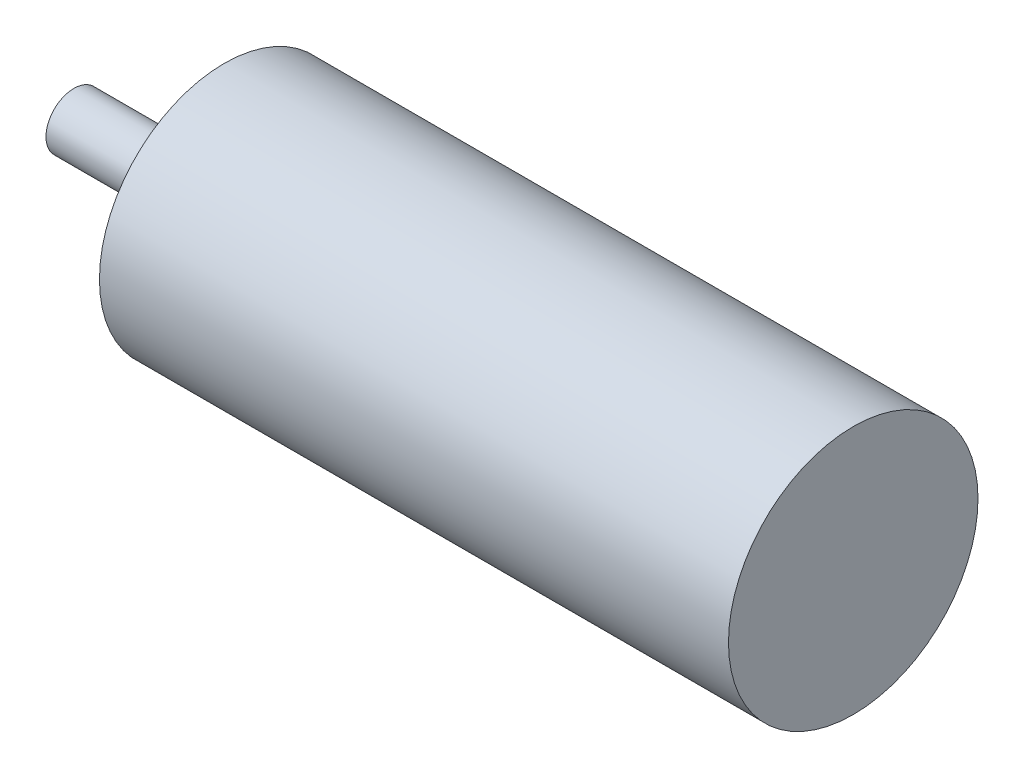
ISO-10303-21;
HEADER;
FILE_DESCRIPTION(('STEP AP214'),'2;1');
FILE_NAME('part.step','',(''),(''),'','','');
FILE_SCHEMA(('AUTOMOTIVE_DESIGN { 1 0 10303 214 1 1 1 1 }'));
ENDSEC;
DATA;
#1=APPLICATION_CONTEXT('core data for automotive mechanical design processes');
#2=APPLICATION_PROTOCOL_DEFINITION('international standard','automotive_design',2000,#1);
#3=PRODUCT_CONTEXT('',#1,'mechanical');
#4=PRODUCT('Part','Part','',(#3));
#5=PRODUCT_RELATED_PRODUCT_CATEGORY('part','',(#4));
#6=PRODUCT_DEFINITION_FORMATION('','',#4);
#7=PRODUCT_DEFINITION_CONTEXT('part definition',#1,'design');
#8=PRODUCT_DEFINITION('design','',#6,#7);
#9=PRODUCT_DEFINITION_SHAPE('','',#8);
#10=(LENGTH_UNIT() NAMED_UNIT(*) SI_UNIT(.MILLI.,.METRE.));
#11=(NAMED_UNIT(*) PLANE_ANGLE_UNIT() SI_UNIT($,.RADIAN.));
#12=(NAMED_UNIT(*) SI_UNIT($,.STERADIAN.) SOLID_ANGLE_UNIT());
#13=UNCERTAINTY_MEASURE_WITH_UNIT(LENGTH_MEASURE(1.E-05),#10,'distance_accuracy_value','');
#14=(GEOMETRIC_REPRESENTATION_CONTEXT(3) GLOBAL_UNCERTAINTY_ASSIGNED_CONTEXT((#13)) GLOBAL_UNIT_ASSIGNED_CONTEXT((#10,
#11,#12)) REPRESENTATION_CONTEXT('',''));
#15=CARTESIAN_POINT('',(0.,0.,0.));
#16=DIRECTION('',(0.,0.,1.));
#17=DIRECTION('',(1.,0.,0.));
#18=AXIS2_PLACEMENT_3D('',#15,#16,#17);
#19=CARTESIAN_POINT('',(0.,0.,0.));
#20=DIRECTION('',(-1.,0.,0.));
#21=DIRECTION('',(0.,-1.,0.));
#22=AXIS2_PLACEMENT_3D('',#19,#20,#21);
#23=PLANE('',#22);
#24=CARTESIAN_POINT('',(0.,0.,0.));
#25=DIRECTION('',(1.,0.,0.));
#26=DIRECTION('',(0.,1.,0.));
#27=AXIS2_PLACEMENT_3D('',#24,#25,#26);
#28=CIRCLE('',#27,4.);
#29=CARTESIAN_POINT('',(0.,4.,0.));
#30=VERTEX_POINT('',#29);
#31=EDGE_CURVE('E10',#30,#30,#28,.T.);
#32=ORIENTED_EDGE('',*,*,#31,.F.);
#33=EDGE_LOOP('',(#32));
#34=FACE_BOUND('',#33,.T.);
#35=ADVANCED_FACE('F41',(#34),#23,.T.);
#36=CARTESIAN_POINT('',(111.5,0.,0.));
#37=DIRECTION('',(1.,0.,0.));
#38=DIRECTION('',(0.,1.,0.));
#39=AXIS2_PLACEMENT_3D('',#36,#37,#38);
#40=CYLINDRICAL_SURFACE('',#39,4.);
#41=ORIENTED_EDGE('',*,*,#31,.T.);
#42=EDGE_LOOP('',(#41));
#43=FACE_BOUND('',#42,.T.);
#44=CARTESIAN_POINT('',(20.,0.,0.));
#45=DIRECTION('',(1.,0.,0.));
#46=DIRECTION('',(0.,1.,0.));
#47=AXIS2_PLACEMENT_3D('',#44,#45,#46);
#48=CIRCLE('',#47,4.);
#49=CARTESIAN_POINT('',(20.,4.,0.));
#50=VERTEX_POINT('',#49);
#51=EDGE_CURVE('E48',#50,#50,#48,.T.);
#52=ORIENTED_EDGE('',*,*,#51,.F.);
#53=EDGE_LOOP('',(#52));
#54=FACE_BOUND('',#53,.T.);
#55=ADVANCED_FACE('F147',(#43,#54),#40,.T.);
#56=CARTESIAN_POINT('',(20.,4.,0.));
#57=DIRECTION('',(-1.,0.,0.));
#58=DIRECTION('',(0.,-1.,0.));
#59=AXIS2_PLACEMENT_3D('',#56,#57,#58);
#60=PLANE('',#59);
#61=ORIENTED_EDGE('',*,*,#51,.T.);
#62=EDGE_LOOP('',(#61));
#63=FACE_BOUND('',#62,.T.);
#64=CARTESIAN_POINT('',(20.,0.,0.));
#65=DIRECTION('',(1.,0.,0.));
#66=DIRECTION('',(0.,1.,0.));
#67=AXIS2_PLACEMENT_3D('',#64,#65,#66);
#68=CIRCLE('',#67,11.);
#69=CARTESIAN_POINT('',(20.,11.,0.));
#70=VERTEX_POINT('',#69);
#71=EDGE_CURVE('E53',#70,#70,#68,.T.);
#72=ORIENTED_EDGE('',*,*,#71,.F.);
#73=EDGE_LOOP('',(#72));
#74=FACE_BOUND('',#73,.T.);
#75=ADVANCED_FACE('F152',(#63,#74),#60,.T.);
#76=CARTESIAN_POINT('',(111.5,0.,0.));
#77=DIRECTION('',(1.,0.,0.));
#78=DIRECTION('',(0.,1.,0.));
#79=AXIS2_PLACEMENT_3D('',#76,#77,#78);
#80=CYLINDRICAL_SURFACE('',#79,11.);
#81=ORIENTED_EDGE('',*,*,#71,.T.);
#82=EDGE_LOOP('',(#81));
#83=FACE_BOUND('',#82,.T.);
#84=CARTESIAN_POINT('',(21.5,0.,0.));
#85=DIRECTION('',(1.,0.,0.));
#86=DIRECTION('',(0.,1.,0.));
#87=AXIS2_PLACEMENT_3D('',#84,#85,#86);
#88=CIRCLE('',#87,11.);
#89=CARTESIAN_POINT('',(21.5,11.,0.));
#90=VERTEX_POINT('',#89);
#91=EDGE_CURVE('E58',#90,#90,#88,.T.);
#92=ORIENTED_EDGE('',*,*,#91,.F.);
#93=EDGE_LOOP('',(#92));
#94=FACE_BOUND('',#93,.T.);
#95=ADVANCED_FACE('F118',(#83,#94),#80,.T.);
#96=CARTESIAN_POINT('',(21.5,11.,0.));
#97=DIRECTION('',(-1.,0.,0.));
#98=DIRECTION('',(0.,-1.,0.));
#99=AXIS2_PLACEMENT_3D('',#96,#97,#98);
#100=PLANE('',#99);
#101=CARTESIAN_POINT('',(21.5,14.,0.));
#102=DIRECTION('',(-1.,0.,0.));
#103=DIRECTION('',(0.,-1.,0.));
#104=AXIS2_PLACEMENT_3D('',#101,#102,#103);
#105=CIRCLE('',#104,1.5);
#106=CARTESIAN_POINT('',(21.5,12.5,0.));
#107=VERTEX_POINT('',#106);
#108=EDGE_CURVE('E97',#107,#107,#105,.T.);
#109=ORIENTED_EDGE('',*,*,#108,.F.);
#110=EDGE_LOOP('',(#109));
#111=FACE_BOUND('',#110,.T.);
#112=CARTESIAN_POINT('',(21.5,0.,14.));
#113=DIRECTION('',(-1.,0.,0.));
#114=DIRECTION('',(0.,-1.,0.));
#115=AXIS2_PLACEMENT_3D('',#112,#113,#114);
#116=CIRCLE('',#115,1.5);
#117=CARTESIAN_POINT('',(21.5,-1.5,14.));
#118=VERTEX_POINT('',#117);
#119=EDGE_CURVE('E93',#118,#118,#116,.T.);
#120=ORIENTED_EDGE('',*,*,#119,.F.);
#121=EDGE_LOOP('',(#120));
#122=FACE_BOUND('',#121,.T.);
#123=CARTESIAN_POINT('',(21.5,-14.,0.));
#124=DIRECTION('',(-1.,0.,0.));
#125=DIRECTION('',(0.,-1.,0.));
#126=AXIS2_PLACEMENT_3D('',#123,#124,#125);
#127=CIRCLE('',#126,1.5);
#128=CARTESIAN_POINT('',(21.5,-15.5,0.));
#129=VERTEX_POINT('',#128);
#130=EDGE_CURVE('E85',#129,#129,#127,.T.);
#131=ORIENTED_EDGE('',*,*,#130,.F.);
#132=EDGE_LOOP('',(#131));
#133=FACE_BOUND('',#132,.T.);
#134=CARTESIAN_POINT('',(21.5,0.,-14.));
#135=DIRECTION('',(-1.,0.,0.));
#136=DIRECTION('',(0.,-1.,0.));
#137=AXIS2_PLACEMENT_3D('',#134,#135,#136);
#138=CIRCLE('',#137,1.5);
#139=CARTESIAN_POINT('',(21.5,-1.5,-14.));
#140=VERTEX_POINT('',#139);
#141=EDGE_CURVE('E77',#140,#140,#138,.T.);
#142=ORIENTED_EDGE('',*,*,#141,.F.);
#143=EDGE_LOOP('',(#142));
#144=FACE_BOUND('',#143,.T.);
#145=ORIENTED_EDGE('',*,*,#91,.T.);
#146=EDGE_LOOP('',(#145));
#147=FACE_BOUND('',#146,.T.);
#148=CARTESIAN_POINT('',(21.5,0.,0.));
#149=DIRECTION('',(1.,0.,0.));
#150=DIRECTION('',(0.,1.,0.));
#151=AXIS2_PLACEMENT_3D('',#148,#149,#150);
#152=CIRCLE('',#151,17.85);
#153=CARTESIAN_POINT('',(21.5,17.85,0.));
#154=VERTEX_POINT('',#153);
#155=EDGE_CURVE('E64',#154,#154,#152,.T.);
#156=ORIENTED_EDGE('',*,*,#155,.F.);
#157=EDGE_LOOP('',(#156));
#158=FACE_BOUND('',#157,.T.);
#159=ADVANCED_FACE('F114',(#111,#122,#133,#144,#147,#158),#100,.T.);
#160=CARTESIAN_POINT('',(111.5,0.,0.));
#161=DIRECTION('',(1.,0.,0.));
#162=DIRECTION('',(0.,1.,0.));
#163=AXIS2_PLACEMENT_3D('',#160,#161,#162);
#164=CYLINDRICAL_SURFACE('',#163,17.85);
#165=ORIENTED_EDGE('',*,*,#155,.T.);
#166=EDGE_LOOP('',(#165));
#167=FACE_BOUND('',#166,.T.);
#168=CARTESIAN_POINT('',(111.5,0.,0.));
#169=DIRECTION('',(1.,0.,0.));
#170=DIRECTION('',(0.,1.,0.));
#171=AXIS2_PLACEMENT_3D('',#168,#169,#170);
#172=CIRCLE('',#171,17.85);
#173=CARTESIAN_POINT('',(111.5,17.85,0.));
#174=VERTEX_POINT('',#173);
#175=EDGE_CURVE('E68',#174,#174,#172,.T.);
#176=ORIENTED_EDGE('',*,*,#175,.F.);
#177=EDGE_LOOP('',(#176));
#178=FACE_BOUND('',#177,.T.);
#179=ADVANCED_FACE('F117',(#167,#178),#164,.T.);
#180=CARTESIAN_POINT('',(111.5,17.85,0.));
#181=DIRECTION('',(1.,0.,0.));
#182=DIRECTION('',(0.,1.,0.));
#183=AXIS2_PLACEMENT_3D('',#180,#181,#182);
#184=PLANE('',#183);
#185=ORIENTED_EDGE('',*,*,#175,.T.);
#186=EDGE_LOOP('',(#185));
#187=FACE_BOUND('',#186,.T.);
#188=ADVANCED_FACE('F132',(#187),#184,.T.);
#189=CARTESIAN_POINT('',(31.5,0.,-14.));
#190=DIRECTION('',(-1.,0.,0.));
#191=DIRECTION('',(0.,-1.,0.));
#192=AXIS2_PLACEMENT_3D('',#189,#190,#191);
#193=CYLINDRICAL_SURFACE('',#192,1.5);
#194=CARTESIAN_POINT('',(31.5,0.,-14.));
#195=DIRECTION('',(-1.,0.,0.));
#196=DIRECTION('',(0.,-1.,0.));
#197=AXIS2_PLACEMENT_3D('',#194,#195,#196);
#198=CIRCLE('',#197,1.5);
#199=CARTESIAN_POINT('',(31.5,-1.5,-14.));
#200=VERTEX_POINT('',#199);
#201=EDGE_CURVE('E73',#200,#200,#198,.T.);
#202=ORIENTED_EDGE('',*,*,#201,.F.);
#203=EDGE_LOOP('',(#202));
#204=FACE_BOUND('',#203,.T.);
#205=ORIENTED_EDGE('',*,*,#141,.T.);
#206=EDGE_LOOP('',(#205));
#207=FACE_BOUND('',#206,.T.);
#208=ADVANCED_FACE('F137',(#204,#207),#193,.F.);
#209=CARTESIAN_POINT('',(31.5,0.,-14.));
#210=DIRECTION('',(-1.,0.,0.));
#211=DIRECTION('',(0.,-1.,0.));
#212=AXIS2_PLACEMENT_3D('',#209,#210,#211);
#213=PLANE('',#212);
#214=ORIENTED_EDGE('',*,*,#201,.T.);
#215=EDGE_LOOP('',(#214));
#216=FACE_BOUND('',#215,.T.);
#217=ADVANCED_FACE('F142',(#216),#213,.T.);
#218=CARTESIAN_POINT('',(31.5,-14.,0.));
#219=DIRECTION('',(-1.,0.,0.));
#220=DIRECTION('',(0.,-1.,0.));
#221=AXIS2_PLACEMENT_3D('',#218,#219,#220);
#222=CYLINDRICAL_SURFACE('',#221,1.5);
#223=CARTESIAN_POINT('',(31.5,-14.,0.));
#224=DIRECTION('',(-1.,0.,0.));
#225=DIRECTION('',(0.,-1.,0.));
#226=AXIS2_PLACEMENT_3D('',#223,#224,#225);
#227=CIRCLE('',#226,1.5);
#228=CARTESIAN_POINT('',(31.5,-15.5,0.));
#229=VERTEX_POINT('',#228);
#230=EDGE_CURVE('E81',#229,#229,#227,.T.);
#231=ORIENTED_EDGE('',*,*,#230,.F.);
#232=EDGE_LOOP('',(#231));
#233=FACE_BOUND('',#232,.T.);
#234=ORIENTED_EDGE('',*,*,#130,.T.);
#235=EDGE_LOOP('',(#234));
#236=FACE_BOUND('',#235,.T.);
#237=ADVANCED_FACE('F201',(#233,#236),#222,.F.);
#238=CARTESIAN_POINT('',(31.5,-14.,0.));
#239=DIRECTION('',(-1.,0.,0.));
#240=DIRECTION('',(0.,-1.,0.));
#241=AXIS2_PLACEMENT_3D('',#238,#239,#240);
#242=PLANE('',#241);
#243=ORIENTED_EDGE('',*,*,#230,.T.);
#244=EDGE_LOOP('',(#243));
#245=FACE_BOUND('',#244,.T.);
#246=ADVANCED_FACE('F211',(#245),#242,.T.);
#247=CARTESIAN_POINT('',(31.5,0.,14.));
#248=DIRECTION('',(-1.,0.,0.));
#249=DIRECTION('',(0.,-1.,0.));
#250=AXIS2_PLACEMENT_3D('',#247,#248,#249);
#251=CYLINDRICAL_SURFACE('',#250,1.5);
#252=CARTESIAN_POINT('',(31.5,0.,14.));
#253=DIRECTION('',(-1.,0.,0.));
#254=DIRECTION('',(0.,-1.,0.));
#255=AXIS2_PLACEMENT_3D('',#252,#253,#254);
#256=CIRCLE('',#255,1.5);
#257=CARTESIAN_POINT('',(31.5,-1.5,14.));
#258=VERTEX_POINT('',#257);
#259=EDGE_CURVE('E89',#258,#258,#256,.T.);
#260=ORIENTED_EDGE('',*,*,#259,.F.);
#261=EDGE_LOOP('',(#260));
#262=FACE_BOUND('',#261,.T.);
#263=ORIENTED_EDGE('',*,*,#119,.T.);
#264=EDGE_LOOP('',(#263));
#265=FACE_BOUND('',#264,.T.);
#266=ADVANCED_FACE('F222',(#262,#265),#251,.F.);
#267=CARTESIAN_POINT('',(31.5,0.,14.));
#268=DIRECTION('',(-1.,0.,0.));
#269=DIRECTION('',(0.,-1.,0.));
#270=AXIS2_PLACEMENT_3D('',#267,#268,#269);
#271=PLANE('',#270);
#272=ORIENTED_EDGE('',*,*,#259,.T.);
#273=EDGE_LOOP('',(#272));
#274=FACE_BOUND('',#273,.T.);
#275=ADVANCED_FACE('F110',(#274),#271,.T.);
#276=CARTESIAN_POINT('',(31.5,14.,0.));
#277=DIRECTION('',(-1.,0.,0.));
#278=DIRECTION('',(0.,-1.,0.));
#279=AXIS2_PLACEMENT_3D('',#276,#277,#278);
#280=CYLINDRICAL_SURFACE('',#279,1.5);
#281=CARTESIAN_POINT('',(31.5,14.,0.));
#282=DIRECTION('',(-1.,0.,0.));
#283=DIRECTION('',(0.,-1.,0.));
#284=AXIS2_PLACEMENT_3D('',#281,#282,#283);
#285=CIRCLE('',#284,1.5);
#286=CARTESIAN_POINT('',(31.5,12.5,0.));
#287=VERTEX_POINT('',#286);
#288=EDGE_CURVE('E72',#287,#287,#285,.T.);
#289=ORIENTED_EDGE('',*,*,#288,.F.);
#290=EDGE_LOOP('',(#289));
#291=FACE_BOUND('',#290,.T.);
#292=ORIENTED_EDGE('',*,*,#108,.T.);
#293=EDGE_LOOP('',(#292));
#294=FACE_BOUND('',#293,.T.);
#295=ADVANCED_FACE('F107',(#291,#294),#280,.F.);
#296=CARTESIAN_POINT('',(31.5,14.,0.));
#297=DIRECTION('',(-1.,0.,0.));
#298=DIRECTION('',(0.,-1.,0.));
#299=AXIS2_PLACEMENT_3D('',#296,#297,#298);
#300=PLANE('',#299);
#301=ORIENTED_EDGE('',*,*,#288,.T.);
#302=EDGE_LOOP('',(#301));
#303=FACE_BOUND('',#302,.T.);
#304=ADVANCED_FACE('F105',(#303),#300,.T.);
#305=CLOSED_SHELL('',(#35,#55,#75,#95,#159,#179,#188,#208,#217,#237,#246,#266,#275,#295,#304));
#306=MANIFOLD_SOLID_BREP('B2',#305);
#307=ADVANCED_BREP_SHAPE_REPRESENTATION('',(#18,#306),#14);
#308=SHAPE_DEFINITION_REPRESENTATION(#9,#307);
ENDSEC;
END-ISO-10303-21;
